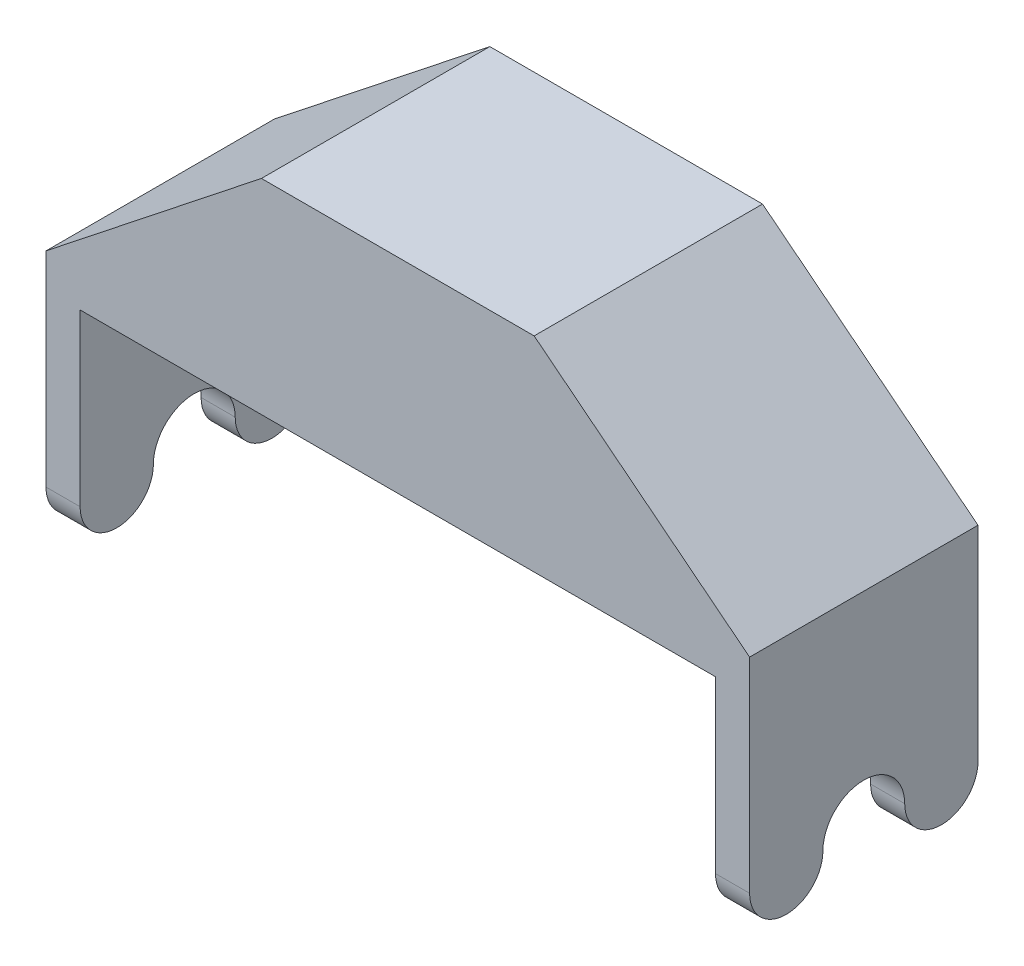
ISO-10303-21;
HEADER;
FILE_DESCRIPTION(('STEP AP214'),'2;1');
FILE_NAME('part.step','',(''),(''),'','','');
FILE_SCHEMA(('AUTOMOTIVE_DESIGN { 1 0 10303 214 1 1 1 1 }'));
ENDSEC;
DATA;
#1=APPLICATION_CONTEXT('core data for automotive mechanical design processes');
#2=APPLICATION_PROTOCOL_DEFINITION('international standard','automotive_design',2000,#1);
#3=PRODUCT_CONTEXT('',#1,'mechanical');
#4=PRODUCT('Part','Part','',(#3));
#5=PRODUCT_RELATED_PRODUCT_CATEGORY('part','',(#4));
#6=PRODUCT_DEFINITION_FORMATION('','',#4);
#7=PRODUCT_DEFINITION_CONTEXT('part definition',#1,'design');
#8=PRODUCT_DEFINITION('design','',#6,#7);
#9=PRODUCT_DEFINITION_SHAPE('','',#8);
#10=(LENGTH_UNIT() NAMED_UNIT(*) SI_UNIT(.MILLI.,.METRE.));
#11=(NAMED_UNIT(*) PLANE_ANGLE_UNIT() SI_UNIT($,.RADIAN.));
#12=(NAMED_UNIT(*) SI_UNIT($,.STERADIAN.) SOLID_ANGLE_UNIT());
#13=UNCERTAINTY_MEASURE_WITH_UNIT(LENGTH_MEASURE(1.E-05),#10,'distance_accuracy_value','');
#14=(GEOMETRIC_REPRESENTATION_CONTEXT(3) GLOBAL_UNCERTAINTY_ASSIGNED_CONTEXT((#13)) GLOBAL_UNIT_ASSIGNED_CONTEXT((#10,
#11,#12)) REPRESENTATION_CONTEXT('',''));
#15=CARTESIAN_POINT('',(0.,0.,0.));
#16=DIRECTION('',(0.,0.,1.));
#17=DIRECTION('',(1.,0.,0.));
#18=AXIS2_PLACEMENT_3D('',#15,#16,#17);
#19=CARTESIAN_POINT('',(68.5705627484771,-0.0762775306967347,16.75));
#20=DIRECTION('',(-1.,0.,0.));
#21=DIRECTION('',(0.,-1.,0.));
#22=AXIS2_PLACEMENT_3D('',#19,#20,#21);
#23=CYLINDRICAL_SURFACE('',#22,6.);
#24=DIRECTION('',(-1.,0.,0.));
#25=VECTOR('',#24,1.);
#26=CARTESIAN_POINT('',(68.5705627484771,-0.0762775306967623,10.75));
#27=LINE('',#26,#25);
#28=CARTESIAN_POINT('',(-46.6,-0.0762775306967614,10.75));
#29=VERTEX_POINT('',#28);
#30=CARTESIAN_POINT('',(-51.6,-0.0762775306967625,10.75));
#31=VERTEX_POINT('',#30);
#32=EDGE_CURVE('E219',#29,#31,#27,.T.);
#33=ORIENTED_EDGE('',*,*,#32,.F.);
#34=CARTESIAN_POINT('',(-46.6,-0.0762775306967614,16.75));
#35=DIRECTION('',(-1.,0.,0.));
#36=DIRECTION('',(0.,0.,1.));
#37=AXIS2_PLACEMENT_3D('',#34,#35,#36);
#38=CIRCLE('',#37,6.);
#39=CARTESIAN_POINT('',(-46.6,-0.0762775306967614,22.75));
#40=VERTEX_POINT('',#39);
#41=EDGE_CURVE('E187',#29,#40,#38,.F.);
#42=ORIENTED_EDGE('',*,*,#41,.T.);
#43=DIRECTION('',(-1.,0.,0.));
#44=VECTOR('',#43,1.);
#45=CARTESIAN_POINT('',(68.5705627484771,-0.0762775306967623,22.75));
#46=LINE('',#45,#44);
#47=CARTESIAN_POINT('',(-51.6,-0.0762775306967623,22.75));
#48=VERTEX_POINT('',#47);
#49=EDGE_CURVE('E69',#48,#40,#46,.F.);
#50=ORIENTED_EDGE('',*,*,#49,.F.);
#51=CARTESIAN_POINT('',(-51.6,-0.0762775306967625,16.75));
#52=DIRECTION('',(-1.,0.,0.));
#53=DIRECTION('',(0.,-1.,0.));
#54=AXIS2_PLACEMENT_3D('',#51,#52,#53);
#55=CIRCLE('',#54,6.);
#56=EDGE_CURVE('E203',#48,#31,#55,.T.);
#57=ORIENTED_EDGE('',*,*,#56,.T.);
#58=EDGE_LOOP('',(#33,#42,#50,#57));
#59=FACE_BOUND('',#58,.T.);
#60=ADVANCED_FACE('F45',(#59),#23,.F.);
#61=CARTESIAN_POINT('',(66.8027957955108,-0.0762775306967352,28.125));
#62=DIRECTION('',(-1.,0.,0.));
#63=DIRECTION('',(0.,-1.,0.));
#64=AXIS2_PLACEMENT_3D('',#61,#62,#63);
#65=CYLINDRICAL_SURFACE('',#64,5.375);
#66=CARTESIAN_POINT('',(-46.6,-0.0762775306967614,28.125));
#67=DIRECTION('',(-1.,0.,0.));
#68=DIRECTION('',(0.,0.,1.));
#69=AXIS2_PLACEMENT_3D('',#66,#67,#68);
#70=CIRCLE('',#69,5.375);
#71=CARTESIAN_POINT('',(-46.6,-0.0762775306967506,33.5));
#72=VERTEX_POINT('',#71);
#73=EDGE_CURVE('E190',#72,#40,#70,.F.);
#74=ORIENTED_EDGE('',*,*,#73,.F.);
#75=DIRECTION('',(1.,0.,0.));
#76=VECTOR('',#75,1.);
#77=CARTESIAN_POINT('',(-51.6,-0.0762775306967623,33.5));
#78=LINE('',#77,#76);
#79=CARTESIAN_POINT('',(-51.6,-0.0762775306967623,33.5));
#80=VERTEX_POINT('',#79);
#81=EDGE_CURVE('E225',#80,#72,#78,.T.);
#82=ORIENTED_EDGE('',*,*,#81,.F.);
#83=CARTESIAN_POINT('',(-51.6,-0.0762775306967625,28.125));
#84=DIRECTION('',(-1.,0.,0.));
#85=DIRECTION('',(0.,-1.,0.));
#86=AXIS2_PLACEMENT_3D('',#83,#84,#85);
#87=CIRCLE('',#86,5.375);
#88=EDGE_CURVE('E199',#48,#80,#87,.T.);
#89=ORIENTED_EDGE('',*,*,#88,.F.);
#90=ORIENTED_EDGE('',*,*,#49,.T.);
#91=EDGE_LOOP('',(#74,#82,#89,#90));
#92=FACE_BOUND('',#91,.T.);
#93=ADVANCED_FACE('F337',(#92),#65,.T.);
#94=CARTESIAN_POINT('',(66.8027957955108,-0.0762775306967352,5.375));
#95=DIRECTION('',(-1.,0.,0.));
#96=DIRECTION('',(0.,-1.,0.));
#97=AXIS2_PLACEMENT_3D('',#94,#95,#96);
#98=CYLINDRICAL_SURFACE('',#97,5.375);
#99=CARTESIAN_POINT('',(-46.6,-0.0762775306967614,5.375));
#100=DIRECTION('',(-1.,0.,0.));
#101=DIRECTION('',(0.,0.,1.));
#102=AXIS2_PLACEMENT_3D('',#99,#100,#101);
#103=CIRCLE('',#102,5.375);
#104=CARTESIAN_POINT('',(-46.6,-0.0762775306967506,0.));
#105=VERTEX_POINT('',#104);
#106=EDGE_CURVE('E11',#29,#105,#103,.F.);
#107=ORIENTED_EDGE('',*,*,#106,.F.);
#108=ORIENTED_EDGE('',*,*,#32,.T.);
#109=CARTESIAN_POINT('',(-51.6,-0.0762775306967625,5.375));
#110=DIRECTION('',(-1.,0.,0.));
#111=DIRECTION('',(0.,-1.,0.));
#112=AXIS2_PLACEMENT_3D('',#109,#110,#111);
#113=CIRCLE('',#112,5.375);
#114=CARTESIAN_POINT('',(-51.6,-0.0762775306967623,0.));
#115=VERTEX_POINT('',#114);
#116=EDGE_CURVE('E194',#115,#31,#113,.T.);
#117=ORIENTED_EDGE('',*,*,#116,.F.);
#118=DIRECTION('',(1.,0.,0.));
#119=VECTOR('',#118,1.);
#120=CARTESIAN_POINT('',(-51.6,-0.0762775306967623,0.));
#121=LINE('',#120,#119);
#122=EDGE_CURVE('E245',#115,#105,#121,.T.);
#123=ORIENTED_EDGE('',*,*,#122,.T.);
#124=EDGE_LOOP('',(#107,#108,#117,#123));
#125=FACE_BOUND('',#124,.T.);
#126=ADVANCED_FACE('F313',(#125),#98,.T.);
#127=CARTESIAN_POINT('',(51.6,-0.0762775306967623,33.5));
#128=DIRECTION('',(-1.,0.,0.));
#129=DIRECTION('',(0.,-1.,0.));
#130=AXIS2_PLACEMENT_3D('',#127,#128,#129);
#131=PLANE('',#130);
#132=CARTESIAN_POINT('',(51.6,-0.0762775306967387,16.75));
#133=DIRECTION('',(-1.,0.,0.));
#134=DIRECTION('',(0.,-1.,0.));
#135=AXIS2_PLACEMENT_3D('',#132,#133,#134);
#136=CIRCLE('',#135,6.);
#137=CARTESIAN_POINT('',(51.6,-0.0762775306967623,10.75));
#138=VERTEX_POINT('',#137);
#139=CARTESIAN_POINT('',(51.6,-0.0762775306967387,22.75));
#140=VERTEX_POINT('',#139);
#141=EDGE_CURVE('E212',#138,#140,#136,.F.);
#142=ORIENTED_EDGE('',*,*,#141,.F.);
#143=CARTESIAN_POINT('',(51.6,-0.0762775306967387,5.375));
#144=DIRECTION('',(-1.,0.,0.));
#145=DIRECTION('',(0.,-1.,0.));
#146=AXIS2_PLACEMENT_3D('',#143,#144,#145);
#147=CIRCLE('',#146,5.375);
#148=CARTESIAN_POINT('',(51.6,-0.0762775306967623,0.));
#149=VERTEX_POINT('',#148);
#150=EDGE_CURVE('E198',#138,#149,#147,.F.);
#151=ORIENTED_EDGE('',*,*,#150,.T.);
#152=DIRECTION('',(0.,1.,0.));
#153=VECTOR('',#152,1.);
#154=CARTESIAN_POINT('',(51.6,-0.0762775306967623,0.));
#155=LINE('',#154,#153);
#156=CARTESIAN_POINT('',(51.6,29.9237224693032,0.));
#157=VERTEX_POINT('',#156);
#158=EDGE_CURVE('E249',#149,#157,#155,.T.);
#159=ORIENTED_EDGE('',*,*,#158,.T.);
#160=DIRECTION('',(0.,0.,-1.));
#161=VECTOR('',#160,1.);
#162=CARTESIAN_POINT('',(51.6,29.9237224693032,33.5));
#163=LINE('',#162,#161);
#164=CARTESIAN_POINT('',(51.6,29.9237224693032,33.5));
#165=VERTEX_POINT('',#164);
#166=EDGE_CURVE('E275',#165,#157,#163,.T.);
#167=ORIENTED_EDGE('',*,*,#166,.F.);
#168=DIRECTION('',(0.,1.,0.));
#169=VECTOR('',#168,1.);
#170=CARTESIAN_POINT('',(51.6,-0.0762775306967623,33.5));
#171=LINE('',#170,#169);
#172=CARTESIAN_POINT('',(51.6,-0.0762775306967623,33.5));
#173=VERTEX_POINT('',#172);
#174=EDGE_CURVE('E228',#173,#165,#171,.T.);
#175=ORIENTED_EDGE('',*,*,#174,.F.);
#176=CARTESIAN_POINT('',(51.6,-0.0762775306967387,28.125));
#177=DIRECTION('',(-1.,0.,0.));
#178=DIRECTION('',(0.,-1.,0.));
#179=AXIS2_PLACEMENT_3D('',#176,#177,#178);
#180=CIRCLE('',#179,5.375);
#181=EDGE_CURVE('E193',#173,#140,#180,.F.);
#182=ORIENTED_EDGE('',*,*,#181,.T.);
#183=EDGE_LOOP('',(#142,#151,#159,#167,#175,#182));
#184=FACE_BOUND('',#183,.T.);
#185=ADVANCED_FACE('F47',(#184),#131,.F.);
#186=CARTESIAN_POINT('',(51.6,29.9237224693032,33.5));
#187=DIRECTION('',(-0.620448640349893,-0.784247081402264,0.));
#188=DIRECTION('',(0.784247081402264,-0.620448640349893,0.));
#189=AXIS2_PLACEMENT_3D('',#186,#187,#188);
#190=PLANE('',#189);
#191=DIRECTION('',(-0.784247081402264,0.620448640349893,0.));
#192=VECTOR('',#191,1.);
#193=CARTESIAN_POINT('',(51.6,29.9237224693032,0.));
#194=LINE('',#193,#192);
#195=CARTESIAN_POINT('',(20.,54.9237224693032,0.));
#196=VERTEX_POINT('',#195);
#197=EDGE_CURVE('E252',#157,#196,#194,.T.);
#198=ORIENTED_EDGE('',*,*,#197,.T.);
#199=DIRECTION('',(0.,0.,-1.));
#200=VECTOR('',#199,1.);
#201=CARTESIAN_POINT('',(20.,54.9237224693032,33.5));
#202=LINE('',#201,#200);
#203=CARTESIAN_POINT('',(20.,54.9237224693032,33.5));
#204=VERTEX_POINT('',#203);
#205=EDGE_CURVE('E271',#204,#196,#202,.T.);
#206=ORIENTED_EDGE('',*,*,#205,.F.);
#207=DIRECTION('',(-0.784247081402264,0.620448640349893,0.));
#208=VECTOR('',#207,1.);
#209=CARTESIAN_POINT('',(51.6,29.9237224693032,33.5));
#210=LINE('',#209,#208);
#211=EDGE_CURVE('E232',#165,#204,#210,.T.);
#212=ORIENTED_EDGE('',*,*,#211,.F.);
#213=ORIENTED_EDGE('',*,*,#166,.T.);
#214=EDGE_LOOP('',(#198,#206,#212,#213));
#215=FACE_BOUND('',#214,.T.);
#216=ADVANCED_FACE('F332',(#215),#190,.F.);
#217=CARTESIAN_POINT('',(20.,54.9237224693032,33.5));
#218=DIRECTION('',(0.,-1.,0.));
#219=DIRECTION('',(0.,0.,-1.));
#220=AXIS2_PLACEMENT_3D('',#217,#218,#219);
#221=PLANE('',#220);
#222=DIRECTION('',(-1.,0.,0.));
#223=VECTOR('',#222,1.);
#224=CARTESIAN_POINT('',(20.,54.9237224693032,0.));
#225=LINE('',#224,#223);
#226=CARTESIAN_POINT('',(-20.,54.9237224693032,0.));
#227=VERTEX_POINT('',#226);
#228=EDGE_CURVE('E255',#196,#227,#225,.T.);
#229=ORIENTED_EDGE('',*,*,#228,.T.);
#230=DIRECTION('',(0.,0.,-1.));
#231=VECTOR('',#230,1.);
#232=CARTESIAN_POINT('',(-20.,54.9237224693032,33.5));
#233=LINE('',#232,#231);
#234=CARTESIAN_POINT('',(-20.,54.9237224693032,33.5));
#235=VERTEX_POINT('',#234);
#236=EDGE_CURVE('E267',#235,#227,#233,.T.);
#237=ORIENTED_EDGE('',*,*,#236,.F.);
#238=DIRECTION('',(-1.,0.,0.));
#239=VECTOR('',#238,1.);
#240=CARTESIAN_POINT('',(20.,54.9237224693032,33.5));
#241=LINE('',#240,#239);
#242=EDGE_CURVE('E235',#204,#235,#241,.T.);
#243=ORIENTED_EDGE('',*,*,#242,.F.);
#244=ORIENTED_EDGE('',*,*,#205,.T.);
#245=EDGE_LOOP('',(#229,#237,#243,#244));
#246=FACE_BOUND('',#245,.T.);
#247=ADVANCED_FACE('F328',(#246),#221,.F.);
#248=CARTESIAN_POINT('',(-20.,54.9237224693032,33.5));
#249=DIRECTION('',(0.620448640349893,-0.784247081402264,0.));
#250=DIRECTION('',(0.784247081402264,0.620448640349893,0.));
#251=AXIS2_PLACEMENT_3D('',#248,#249,#250);
#252=PLANE('',#251);
#253=DIRECTION('',(-0.784247081402264,-0.620448640349893,0.));
#254=VECTOR('',#253,1.);
#255=CARTESIAN_POINT('',(-20.,54.9237224693032,0.));
#256=LINE('',#255,#254);
#257=CARTESIAN_POINT('',(-51.6,29.9237224693032,0.));
#258=VERTEX_POINT('',#257);
#259=EDGE_CURVE('E258',#227,#258,#256,.T.);
#260=ORIENTED_EDGE('',*,*,#259,.T.);
#261=DIRECTION('',(0.,0.,-1.));
#262=VECTOR('',#261,1.);
#263=CARTESIAN_POINT('',(-51.6,29.9237224693032,33.5));
#264=LINE('',#263,#262);
#265=CARTESIAN_POINT('',(-51.6,29.9237224693032,33.5));
#266=VERTEX_POINT('',#265);
#267=EDGE_CURVE('E244',#266,#258,#264,.T.);
#268=ORIENTED_EDGE('',*,*,#267,.F.);
#269=DIRECTION('',(-0.784247081402264,-0.620448640349893,0.));
#270=VECTOR('',#269,1.);
#271=CARTESIAN_POINT('',(-20.,54.9237224693032,33.5));
#272=LINE('',#271,#270);
#273=EDGE_CURVE('E238',#235,#266,#272,.T.);
#274=ORIENTED_EDGE('',*,*,#273,.F.);
#275=ORIENTED_EDGE('',*,*,#236,.T.);
#276=EDGE_LOOP('',(#260,#268,#274,#275));
#277=FACE_BOUND('',#276,.T.);
#278=ADVANCED_FACE('F323',(#277),#252,.F.);
#279=CARTESIAN_POINT('',(-51.6,29.9237224693032,33.5));
#280=DIRECTION('',(1.,0.,0.));
#281=DIRECTION('',(0.,1.,0.));
#282=AXIS2_PLACEMENT_3D('',#279,#280,#281);
#283=PLANE('',#282);
#284=DIRECTION('',(0.,-1.,0.));
#285=VECTOR('',#284,1.);
#286=CARTESIAN_POINT('',(-51.6,29.9237224693032,0.));
#287=LINE('',#286,#285);
#288=EDGE_CURVE('E261',#258,#115,#287,.T.);
#289=ORIENTED_EDGE('',*,*,#288,.T.);
#290=ORIENTED_EDGE('',*,*,#116,.T.);
#291=ORIENTED_EDGE('',*,*,#56,.F.);
#292=ORIENTED_EDGE('',*,*,#88,.T.);
#293=DIRECTION('',(0.,-1.,0.));
#294=VECTOR('',#293,1.);
#295=CARTESIAN_POINT('',(-51.6,29.9237224693032,33.5));
#296=LINE('',#295,#294);
#297=EDGE_CURVE('E241',#266,#80,#296,.T.);
#298=ORIENTED_EDGE('',*,*,#297,.F.);
#299=ORIENTED_EDGE('',*,*,#267,.T.);
#300=EDGE_LOOP('',(#289,#290,#291,#292,#298,#299));
#301=FACE_BOUND('',#300,.T.);
#302=ADVANCED_FACE('F316',(#301),#283,.F.);
#303=CARTESIAN_POINT('',(0.,0.,33.5));
#304=DIRECTION('',(0.,0.,1.));
#305=DIRECTION('',(1.,0.,0.));
#306=AXIS2_PLACEMENT_3D('',#303,#304,#305);
#307=PLANE('',#306);
#308=DIRECTION('',(0.,-1.,0.));
#309=VECTOR('',#308,1.);
#310=CARTESIAN_POINT('',(-46.6,-0.0762775306967623,33.5));
#311=LINE('',#310,#309);
#312=CARTESIAN_POINT('',(-46.6,24.9237224693032,33.5));
#313=VERTEX_POINT('',#312);
#314=EDGE_CURVE('E168',#313,#72,#311,.T.);
#315=ORIENTED_EDGE('',*,*,#314,.F.);
#316=DIRECTION('',(-1.,0.,0.));
#317=VECTOR('',#316,1.);
#318=CARTESIAN_POINT('',(-46.6,24.9237224693032,33.5));
#319=LINE('',#318,#317);
#320=CARTESIAN_POINT('',(46.6,24.9237224693032,33.5));
#321=VERTEX_POINT('',#320);
#322=EDGE_CURVE('E157',#321,#313,#319,.T.);
#323=ORIENTED_EDGE('',*,*,#322,.F.);
#324=DIRECTION('',(0.,1.,0.));
#325=VECTOR('',#324,1.);
#326=CARTESIAN_POINT('',(46.6,24.9237224693032,33.5));
#327=LINE('',#326,#325);
#328=CARTESIAN_POINT('',(46.6,-0.07627753069675,33.5));
#329=VERTEX_POINT('',#328);
#330=EDGE_CURVE('E147',#329,#321,#327,.T.);
#331=ORIENTED_EDGE('',*,*,#330,.F.);
#332=EDGE_CURVE('E229',#329,#173,#78,.T.);
#333=ORIENTED_EDGE('',*,*,#332,.T.);
#334=ORIENTED_EDGE('',*,*,#174,.T.);
#335=ORIENTED_EDGE('',*,*,#211,.T.);
#336=ORIENTED_EDGE('',*,*,#242,.T.);
#337=ORIENTED_EDGE('',*,*,#273,.T.);
#338=ORIENTED_EDGE('',*,*,#297,.T.);
#339=ORIENTED_EDGE('',*,*,#81,.T.);
#340=EDGE_LOOP('',(#315,#323,#331,#333,#334,#335,#336,#337,#338,#339));
#341=FACE_BOUND('',#340,.T.);
#342=ADVANCED_FACE('F170',(#341),#307,.T.);
#343=CARTESIAN_POINT('',(0.,0.,0.));
#344=DIRECTION('',(0.,0.,1.));
#345=DIRECTION('',(1.,0.,0.));
#346=AXIS2_PLACEMENT_3D('',#343,#344,#345);
#347=PLANE('',#346);
#348=DIRECTION('',(1.,0.,0.));
#349=VECTOR('',#348,1.);
#350=CARTESIAN_POINT('',(-46.6,24.9237224693032,0.));
#351=LINE('',#350,#349);
#352=CARTESIAN_POINT('',(-46.6,24.9237224693032,0.));
#353=VERTEX_POINT('',#352);
#354=CARTESIAN_POINT('',(46.6,24.9237224693032,0.));
#355=VERTEX_POINT('',#354);
#356=EDGE_CURVE('E165',#353,#355,#351,.T.);
#357=ORIENTED_EDGE('',*,*,#356,.F.);
#358=DIRECTION('',(0.,1.,0.));
#359=VECTOR('',#358,1.);
#360=CARTESIAN_POINT('',(-46.6,-0.0762775306967623,0.));
#361=LINE('',#360,#359);
#362=EDGE_CURVE('E184',#105,#353,#361,.T.);
#363=ORIENTED_EDGE('',*,*,#362,.F.);
#364=ORIENTED_EDGE('',*,*,#122,.F.);
#365=ORIENTED_EDGE('',*,*,#288,.F.);
#366=ORIENTED_EDGE('',*,*,#259,.F.);
#367=ORIENTED_EDGE('',*,*,#228,.F.);
#368=ORIENTED_EDGE('',*,*,#197,.F.);
#369=ORIENTED_EDGE('',*,*,#158,.F.);
#370=CARTESIAN_POINT('',(46.6,-0.0762775306967623,0.));
#371=VERTEX_POINT('',#370);
#372=EDGE_CURVE('E224',#371,#149,#121,.T.);
#373=ORIENTED_EDGE('',*,*,#372,.F.);
#374=DIRECTION('',(0.,-1.,0.));
#375=VECTOR('',#374,1.);
#376=CARTESIAN_POINT('',(46.6,24.9237224693032,0.));
#377=LINE('',#376,#375);
#378=EDGE_CURVE('E61',#355,#371,#377,.T.);
#379=ORIENTED_EDGE('',*,*,#378,.F.);
#380=EDGE_LOOP('',(#357,#363,#364,#365,#366,#367,#368,#369,#373,#379));
#381=FACE_BOUND('',#380,.T.);
#382=ADVANCED_FACE('F307',(#381),#347,.F.);
#383=CARTESIAN_POINT('',(46.6,-0.0762775306967623,22.75));
#384=VERTEX_POINT('',#383);
#385=EDGE_CURVE('E216',#384,#140,#46,.F.);
#386=ORIENTED_EDGE('',*,*,#385,.F.);
#387=CARTESIAN_POINT('',(46.6,-0.0762775306967398,16.75));
#388=DIRECTION('',(1.,0.,0.));
#389=DIRECTION('',(0.,0.,-1.));
#390=AXIS2_PLACEMENT_3D('',#387,#388,#389);
#391=CIRCLE('',#390,6.);
#392=CARTESIAN_POINT('',(46.6,-0.0762775306967623,10.75));
#393=VERTEX_POINT('',#392);
#394=EDGE_CURVE('E180',#384,#393,#391,.F.);
#395=ORIENTED_EDGE('',*,*,#394,.T.);
#396=EDGE_CURVE('E220',#138,#393,#27,.T.);
#397=ORIENTED_EDGE('',*,*,#396,.F.);
#398=ORIENTED_EDGE('',*,*,#141,.T.);
#399=EDGE_LOOP('',(#386,#395,#397,#398));
#400=FACE_BOUND('',#399,.T.);
#401=ADVANCED_FACE('F283',(#400),#23,.F.);
#402=CARTESIAN_POINT('',(46.6,-0.0762775306967398,28.125));
#403=DIRECTION('',(1.,0.,0.));
#404=DIRECTION('',(0.,0.,-1.));
#405=AXIS2_PLACEMENT_3D('',#402,#403,#404);
#406=CIRCLE('',#405,5.375);
#407=EDGE_CURVE('E152',#384,#329,#406,.F.);
#408=ORIENTED_EDGE('',*,*,#407,.F.);
#409=ORIENTED_EDGE('',*,*,#385,.T.);
#410=ORIENTED_EDGE('',*,*,#181,.F.);
#411=ORIENTED_EDGE('',*,*,#332,.F.);
#412=EDGE_LOOP('',(#408,#409,#410,#411));
#413=FACE_BOUND('',#412,.T.);
#414=ADVANCED_FACE('F293',(#413),#65,.T.);
#415=CARTESIAN_POINT('',(46.6,-0.0762775306967398,5.375));
#416=DIRECTION('',(1.,0.,0.));
#417=DIRECTION('',(0.,0.,-1.));
#418=AXIS2_PLACEMENT_3D('',#415,#416,#417);
#419=CIRCLE('',#418,5.375);
#420=EDGE_CURVE('E54',#371,#393,#419,.F.);
#421=ORIENTED_EDGE('',*,*,#420,.F.);
#422=ORIENTED_EDGE('',*,*,#372,.T.);
#423=ORIENTED_EDGE('',*,*,#150,.F.);
#424=ORIENTED_EDGE('',*,*,#396,.T.);
#425=EDGE_LOOP('',(#421,#422,#423,#424));
#426=FACE_BOUND('',#425,.T.);
#427=ADVANCED_FACE('F286',(#426),#98,.T.);
#428=CARTESIAN_POINT('',(-46.6,-0.0762775306967623,-100.288765804928));
#429=DIRECTION('',(-1.,0.,0.));
#430=DIRECTION('',(0.,0.,1.));
#431=AXIS2_PLACEMENT_3D('',#428,#429,#430);
#432=PLANE('',#431);
#433=ORIENTED_EDGE('',*,*,#73,.T.);
#434=ORIENTED_EDGE('',*,*,#41,.F.);
#435=ORIENTED_EDGE('',*,*,#106,.T.);
#436=ORIENTED_EDGE('',*,*,#362,.T.);
#437=DIRECTION('',(0.,0.,1.));
#438=VECTOR('',#437,1.);
#439=CARTESIAN_POINT('',(-46.6,24.9237224693032,-100.288765804928));
#440=LINE('',#439,#438);
#441=EDGE_CURVE('E167',#353,#313,#440,.T.);
#442=ORIENTED_EDGE('',*,*,#441,.T.);
#443=ORIENTED_EDGE('',*,*,#314,.T.);
#444=EDGE_LOOP('',(#433,#434,#435,#436,#442,#443));
#445=FACE_BOUND('',#444,.T.);
#446=ADVANCED_FACE('F303',(#445),#432,.F.);
#447=CARTESIAN_POINT('',(-46.6,24.9237224693032,-100.288765804928));
#448=DIRECTION('',(0.,1.,0.));
#449=DIRECTION('',(0.,0.,1.));
#450=AXIS2_PLACEMENT_3D('',#447,#448,#449);
#451=PLANE('',#450);
#452=ORIENTED_EDGE('',*,*,#356,.T.);
#453=DIRECTION('',(0.,0.,1.));
#454=VECTOR('',#453,1.);
#455=CARTESIAN_POINT('',(46.6,24.9237224693032,-100.288765804928));
#456=LINE('',#455,#454);
#457=EDGE_CURVE('E150',#355,#321,#456,.T.);
#458=ORIENTED_EDGE('',*,*,#457,.T.);
#459=ORIENTED_EDGE('',*,*,#322,.T.);
#460=ORIENTED_EDGE('',*,*,#441,.F.);
#461=EDGE_LOOP('',(#452,#458,#459,#460));
#462=FACE_BOUND('',#461,.T.);
#463=ADVANCED_FACE('F161',(#462),#451,.F.);
#464=CARTESIAN_POINT('',(46.6,24.9237224693032,-100.288765804928));
#465=DIRECTION('',(1.,0.,0.));
#466=DIRECTION('',(0.,0.,-1.));
#467=AXIS2_PLACEMENT_3D('',#464,#465,#466);
#468=PLANE('',#467);
#469=ORIENTED_EDGE('',*,*,#407,.T.);
#470=ORIENTED_EDGE('',*,*,#330,.T.);
#471=ORIENTED_EDGE('',*,*,#457,.F.);
#472=ORIENTED_EDGE('',*,*,#378,.T.);
#473=ORIENTED_EDGE('',*,*,#420,.T.);
#474=ORIENTED_EDGE('',*,*,#394,.F.);
#475=EDGE_LOOP('',(#469,#470,#471,#472,#473,#474));
#476=FACE_BOUND('',#475,.T.);
#477=ADVANCED_FACE('F149',(#476),#468,.F.);
#478=CLOSED_SHELL('',(#60,#93,#126,#185,#216,#247,#278,#302,#342,#382,#401,#414,#427,#446,#463,#477));
#479=MANIFOLD_SOLID_BREP('B2',#478);
#480=ADVANCED_BREP_SHAPE_REPRESENTATION('',(#18,#479),#14);
#481=SHAPE_DEFINITION_REPRESENTATION(#9,#480);
ENDSEC;
END-ISO-10303-21;
